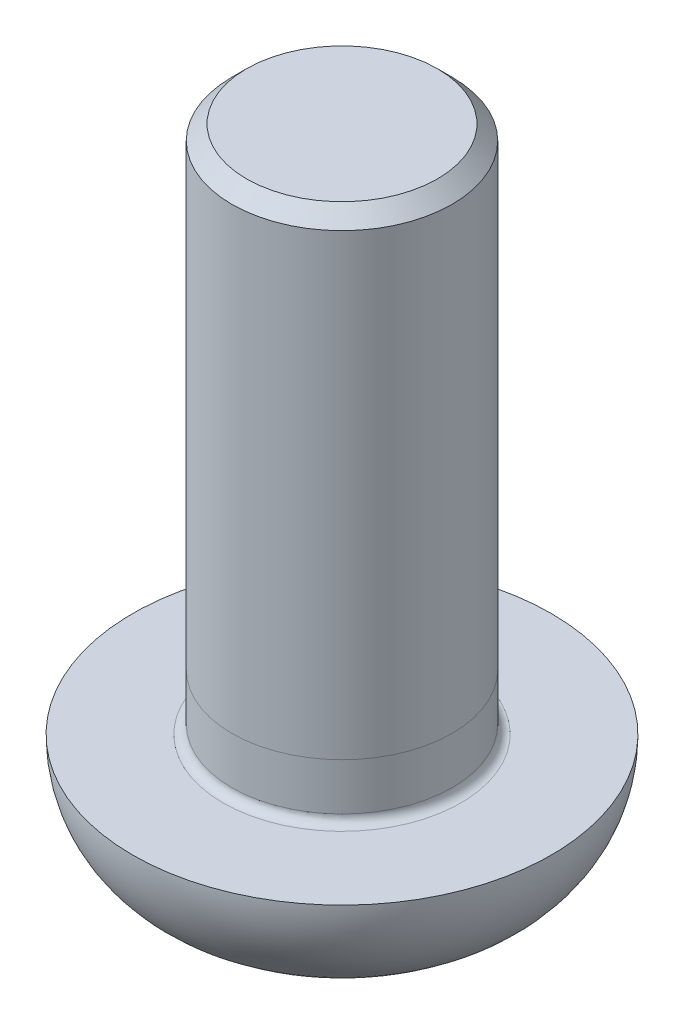
ISO-10303-21;
HEADER;
FILE_DESCRIPTION(('STEP AP214'),'2;1');
FILE_NAME('part.step','',(''),(''),'','','');
FILE_SCHEMA(('AUTOMOTIVE_DESIGN { 1 0 10303 214 1 1 1 1 }'));
ENDSEC;
DATA;
#1=APPLICATION_CONTEXT('core data for automotive mechanical design processes');
#2=APPLICATION_PROTOCOL_DEFINITION('international standard','automotive_design',2000,#1);
#3=PRODUCT_CONTEXT('',#1,'mechanical');
#4=PRODUCT('Part','Part','',(#3));
#5=PRODUCT_RELATED_PRODUCT_CATEGORY('part','',(#4));
#6=PRODUCT_DEFINITION_FORMATION('','',#4);
#7=PRODUCT_DEFINITION_CONTEXT('part definition',#1,'design');
#8=PRODUCT_DEFINITION('design','',#6,#7);
#9=PRODUCT_DEFINITION_SHAPE('','',#8);
#10=(LENGTH_UNIT() NAMED_UNIT(*) SI_UNIT(.MILLI.,.METRE.));
#11=(NAMED_UNIT(*) PLANE_ANGLE_UNIT() SI_UNIT($,.RADIAN.));
#12=(NAMED_UNIT(*) SI_UNIT($,.STERADIAN.) SOLID_ANGLE_UNIT());
#13=UNCERTAINTY_MEASURE_WITH_UNIT(LENGTH_MEASURE(1.E-05),#10,'distance_accuracy_value','');
#14=(GEOMETRIC_REPRESENTATION_CONTEXT(3) GLOBAL_UNCERTAINTY_ASSIGNED_CONTEXT((#13)) GLOBAL_UNIT_ASSIGNED_CONTEXT((#10,
#11,#12)) REPRESENTATION_CONTEXT('',''));
#15=CARTESIAN_POINT('',(0.,0.,0.));
#16=DIRECTION('',(0.,0.,1.));
#17=DIRECTION('',(1.,0.,0.));
#18=AXIS2_PLACEMENT_3D('',#15,#16,#17);
#19=CARTESIAN_POINT('',(0.,0.,0.));
#20=DIRECTION('',(0.,1.,0.));
#21=DIRECTION('',(0.,0.,1.));
#22=AXIS2_PLACEMENT_3D('',#19,#20,#21);
#23=CYLINDRICAL_SURFACE('',#22,2.5);
#24=CARTESIAN_POINT('',(0.,11.6666666666667,0.));
#25=DIRECTION('',(0.,1.,0.));
#26=DIRECTION('',(0.,0.,1.));
#27=AXIS2_PLACEMENT_3D('',#24,#25,#26);
#28=CIRCLE('',#27,2.5);
#29=CARTESIAN_POINT('',(0.,11.6666666666667,2.5));
#30=VERTEX_POINT('',#29);
#31=EDGE_CURVE('E28',#30,#30,#28,.F.);
#32=ORIENTED_EDGE('',*,*,#31,.T.);
#33=EDGE_LOOP('',(#32));
#34=FACE_BOUND('',#33,.T.);
#35=CARTESIAN_POINT('',(0.,1.26666666666666,0.));
#36=DIRECTION('',(0.,1.,0.));
#37=DIRECTION('',(0.,0.,1.));
#38=AXIS2_PLACEMENT_3D('',#35,#36,#37);
#39=CIRCLE('',#38,2.5);
#40=CARTESIAN_POINT('',(0.,1.26666666666666,2.5));
#41=VERTEX_POINT('',#40);
#42=EDGE_CURVE('E11',#41,#41,#39,.T.);
#43=ORIENTED_EDGE('',*,*,#42,.T.);
#44=EDGE_LOOP('',(#43));
#45=FACE_BOUND('',#44,.T.);
#46=ADVANCED_FACE('F18',(#34,#45),#23,.T.);
#47=ORIENTED_EDGE('',*,*,#42,.F.);
#48=EDGE_LOOP('',(#47));
#49=FACE_BOUND('',#48,.T.);
#50=CARTESIAN_POINT('',(0.,0.2,0.));
#51=DIRECTION('',(0.,1.,0.));
#52=DIRECTION('',(0.,0.,1.));
#53=AXIS2_PLACEMENT_3D('',#50,#51,#52);
#54=CIRCLE('',#53,2.5);
#55=CARTESIAN_POINT('',(0.,0.2,2.5));
#56=VERTEX_POINT('',#55);
#57=EDGE_CURVE('E280',#56,#56,#54,.T.);
#58=ORIENTED_EDGE('',*,*,#57,.T.);
#59=EDGE_LOOP('',(#58));
#60=FACE_BOUND('',#59,.T.);
#61=ADVANCED_FACE('F192',(#49,#60),#23,.T.);
#62=CARTESIAN_POINT('',(4.75,0.,0.));
#63=DIRECTION('',(0.,1.,0.));
#64=DIRECTION('',(0.,0.,1.));
#65=AXIS2_PLACEMENT_3D('',#62,#63,#64);
#66=PLANE('',#65);
#67=CARTESIAN_POINT('',(0.,0.,0.));
#68=DIRECTION('',(0.,1.,0.));
#69=DIRECTION('',(0.,0.,1.));
#70=AXIS2_PLACEMENT_3D('',#67,#68,#69);
#71=CIRCLE('',#70,2.7);
#72=CARTESIAN_POINT('',(0.,0.,2.7));
#73=VERTEX_POINT('',#72);
#74=EDGE_CURVE('E277',#73,#73,#71,.F.);
#75=ORIENTED_EDGE('',*,*,#74,.T.);
#76=EDGE_LOOP('',(#75));
#77=FACE_BOUND('',#76,.T.);
#78=CARTESIAN_POINT('',(0.,0.,0.));
#79=DIRECTION('',(0.,1.,0.));
#80=DIRECTION('',(0.,0.,1.));
#81=AXIS2_PLACEMENT_3D('',#78,#79,#80);
#82=CIRCLE('',#81,4.75);
#83=CARTESIAN_POINT('',(0.,0.,4.75));
#84=VERTEX_POINT('',#83);
#85=EDGE_CURVE('E108',#84,#84,#82,.T.);
#86=ORIENTED_EDGE('',*,*,#85,.T.);
#87=EDGE_LOOP('',(#86));
#88=FACE_BOUND('',#87,.T.);
#89=ADVANCED_FACE('F199',(#77,#88),#66,.T.);
#90=CARTESIAN_POINT('',(0.,12.,0.));
#91=DIRECTION('',(0.,1.,0.));
#92=DIRECTION('',(0.,0.,1.));
#93=AXIS2_PLACEMENT_3D('',#90,#91,#92);
#94=PLANE('',#93);
#95=CARTESIAN_POINT('',(0.,12.,0.));
#96=DIRECTION('',(0.,1.,0.));
#97=DIRECTION('',(0.,0.,1.));
#98=AXIS2_PLACEMENT_3D('',#95,#96,#97);
#99=CIRCLE('',#98,2.16666666666667);
#100=CARTESIAN_POINT('',(0.,12.,2.16666666666667));
#101=VERTEX_POINT('',#100);
#102=EDGE_CURVE('E282',#101,#101,#99,.T.);
#103=ORIENTED_EDGE('',*,*,#102,.T.);
#104=EDGE_LOOP('',(#103));
#105=FACE_BOUND('',#104,.T.);
#106=ADVANCED_FACE('F227',(#105),#94,.T.);
#107=CARTESIAN_POINT('',(0.,0.2,0.));
#108=DIRECTION('',(0.,1.,0.));
#109=DIRECTION('',(0.,0.,1.));
#110=AXIS2_PLACEMENT_3D('',#107,#108,#109);
#111=TOROIDAL_SURFACE('',#110,2.7,0.2);
#112=ORIENTED_EDGE('',*,*,#74,.F.);
#113=EDGE_LOOP('',(#112));
#114=FACE_BOUND('',#113,.T.);
#115=ORIENTED_EDGE('',*,*,#57,.F.);
#116=EDGE_LOOP('',(#115));
#117=FACE_BOUND('',#116,.T.);
#118=ADVANCED_FACE('F265',(#114,#117),#111,.F.);
#119=CARTESIAN_POINT('',(0.,12.,0.));
#120=DIRECTION('',(0.,-1.,0.));
#121=DIRECTION('',(0.,0.,-1.));
#122=AXIS2_PLACEMENT_3D('',#119,#120,#121);
#123=CONICAL_SURFACE('',#122,2.16666666666667,0.785398163397449);
#124=ORIENTED_EDGE('',*,*,#31,.F.);
#125=EDGE_LOOP('',(#124));
#126=FACE_BOUND('',#125,.T.);
#127=ORIENTED_EDGE('',*,*,#102,.F.);
#128=EDGE_LOOP('',(#127));
#129=FACE_BOUND('',#128,.T.);
#130=ADVANCED_FACE('F21',(#126,#129),#123,.T.);
#131=CARTESIAN_POINT('',(0.,0.,0.));
#132=DIRECTION('',(0.,-1.,0.));
#133=DIRECTION('',(0.,0.,-1.));
#134=AXIS2_PLACEMENT_3D('',#131,#132,#133);
#135=DEGENERATE_TOROIDAL_SURFACE('',#134,1.98223347818215,2.76776652181785,.T.);
#136=ORIENTED_EDGE('',*,*,#85,.F.);
#137=EDGE_LOOP('',(#136));
#138=FACE_BOUND('',#137,.T.);
#139=CARTESIAN_POINT('',(0.,-2.75,0.));
#140=DIRECTION('',(0.,-1.,0.));
#141=DIRECTION('',(0.,0.,-1.));
#142=AXIS2_PLACEMENT_3D('',#139,#140,#141);
#143=CIRCLE('',#142,2.29533333333334);
#144=CARTESIAN_POINT('',(0.,-2.75,-2.29533333333334));
#145=VERTEX_POINT('',#144);
#146=EDGE_CURVE('E119',#145,#145,#143,.T.);
#147=ORIENTED_EDGE('',*,*,#146,.F.);
#148=EDGE_LOOP('',(#147));
#149=FACE_BOUND('',#148,.T.);
#150=ADVANCED_FACE('F143',(#138,#149),#135,.T.);
#151=CARTESIAN_POINT('',(0.,0.0925836230047557,0.));
#152=DIRECTION('',(0.,-1.,0.));
#153=DIRECTION('',(0.,0.,-1.));
#154=AXIS2_PLACEMENT_3D('',#151,#152,#153);
#155=CONICAL_SURFACE('',#154,0.,1.0471975511966);
#156=CARTESIAN_POINT('',(0.,0.0925836230047561,0.));
#157=VERTEX_POINT('',#156);
#158=VERTEX_LOOP('',#157);
#159=FACE_BOUND('',#158,.T.);
#160=CARTESIAN_POINT('',(-0.865909933730604,-0.907483050328135,1.5002));
#161=CARTESIAN_POINT('',(-0.90396845419345,-0.885499233548862,1.43428070889745));
#162=CARTESIAN_POINT('',(-0.942355490953076,-0.865505266461506,1.36779241087776));
#163=CARTESIAN_POINT('',(-1.01979436916422,-0.83060447796419,1.23366433933493));
#164=CARTESIAN_POINT('',(-1.05884758728359,-0.81571000510285,1.16602218135311));
#165=CARTESIAN_POINT('',(-1.13646999803242,-0.792523058089927,1.03157622213015));
#166=CARTESIAN_POINT('',(-1.17502724286933,-0.784076288491498,0.96479311507275));
#167=CARTESIAN_POINT('',(-1.25232329150577,-0.773989954291537,0.830912431610116));
#168=CARTESIAN_POINT('',(-1.29106181408334,-0.772342040137575,0.763815342295616));
#169=CARTESIAN_POINT('',(-1.36345580713301,-0.775757999832789,0.6384252681708));
#170=CARTESIAN_POINT('',(-1.39712207785429,-0.779983136003665,0.580113576780177));
#171=CARTESIAN_POINT('',(-1.46423526865157,-0.793378152212355,0.463870120461215));
#172=CARTESIAN_POINT('',(-1.49768195634506,-0.802552614395533,0.405938758031212));
#173=CARTESIAN_POINT('',(-1.56493368410116,-0.825489560734679,0.289455348660846));
#174=CARTESIAN_POINT('',(-1.59873020609217,-0.83934933894113,0.230918055453307));
#175=CARTESIAN_POINT('',(-1.6658189879754,-0.87080616101634,0.11471687661364));
#176=CARTESIAN_POINT('',(-1.699112108342,-0.888395806669299,0.0570515005961895));
#177=CARTESIAN_POINT('',(-1.73216627762271,-0.907483050328134,-0.000200000000000156));
#178=B_SPLINE_CURVE_WITH_KNOTS('',3,(#160,#161,#162,#163,#164,#165,#166,#167,#168,#169,#170,
#171,#172,#173,#174,#175,#176,#177),.UNSPECIFIED.,.F.,.F.,(4,2,2,2,2,2,2,2,4),(0.,
0.237777822177385,0.476127422841921,0.708577067230594,0.940741159251585,1.14294352835891,
1.34533342091876,1.55221450553907,1.75868901573748),.UNSPECIFIED.);
#179=CARTESIAN_POINT('',(-0.866025403784442,-0.907416376995246,1.5));
#180=VERTEX_POINT('',#179);
#181=CARTESIAN_POINT('',(-1.73205080756887,-0.907416376995245,0.));
#182=VERTEX_POINT('',#181);
#183=EDGE_CURVE('E231',#180,#182,#178,.T.);
#184=ORIENTED_EDGE('',*,*,#183,.T.);
#185=CARTESIAN_POINT('',(-1.73216627762271,-0.907483050328134,0.000199999999999923));
#186=CARTESIAN_POINT('',(-1.69410775715987,-0.88549923354886,-0.0657192911025469));
#187=CARTESIAN_POINT('',(-1.65572072040024,-0.865505266461504,-0.132207589122234));
#188=CARTESIAN_POINT('',(-1.5782818421891,-0.830604477964188,-0.266335660665069));
#189=CARTESIAN_POINT('',(-1.53922862406973,-0.815710005102848,-0.333977818646885));
#190=CARTESIAN_POINT('',(-1.4616062133209,-0.792523058089924,-0.468423777869842));
#191=CARTESIAN_POINT('',(-1.42304896848399,-0.784076288491495,-0.535206884927247));
#192=CARTESIAN_POINT('',(-1.34575291984755,-0.773989954291535,-0.66908756838988));
#193=CARTESIAN_POINT('',(-1.30701439726998,-0.772342040137574,-0.736184657704378));
#194=CARTESIAN_POINT('',(-1.23462040422031,-0.775757999832787,-0.861574731829195));
#195=CARTESIAN_POINT('',(-1.20095413349903,-0.779983136003662,-0.919886423219819));
#196=CARTESIAN_POINT('',(-1.13384094270174,-0.793378152212352,-1.03612987953878));
#197=CARTESIAN_POINT('',(-1.10039425500826,-0.802552614395529,-1.09406124196879));
#198=CARTESIAN_POINT('',(-1.03314252725215,-0.825489560734676,-1.21054465133915));
#199=CARTESIAN_POINT('',(-0.999346005261149,-0.839349338941128,-1.26908194454669));
#200=CARTESIAN_POINT('',(-0.932257223377915,-0.870806161016338,-1.38528312338636));
#201=CARTESIAN_POINT('',(-0.898964103011318,-0.888395806669298,-1.44294849940381));
#202=CARTESIAN_POINT('',(-0.865909933730598,-0.907483050328134,-1.5002));
#203=B_SPLINE_CURVE_WITH_KNOTS('',3,(#185,#186,#187,#188,#189,#190,#191,#192,#193,#194,#195,
#196,#197,#198,#199,#200,#201,#202),.UNSPECIFIED.,.F.,.F.,(4,2,2,2,2,2,2,2,4),(0.,
0.237777822177384,0.476127422841919,0.70857706723059,0.940741159251581,1.14294352835891,
1.34533342091876,1.55221450553907,1.75868901573748),.UNSPECIFIED.);
#204=CARTESIAN_POINT('',(-0.866025403784436,-0.907416376995246,-1.5));
#205=VERTEX_POINT('',#204);
#206=EDGE_CURVE('E210',#182,#205,#203,.T.);
#207=ORIENTED_EDGE('',*,*,#206,.T.);
#208=CARTESIAN_POINT('',(-3.02145642388414,-1.85499597925637,-1.5));
#209=CARTESIAN_POINT('',(-2.95131363222548,-1.81872634413046,-1.5));
#210=CARTESIAN_POINT('',(-2.88107133565645,-1.78264804643317,-1.5));
#211=CARTESIAN_POINT('',(-2.74034345018755,-1.71096639873344,-1.5));
#212=CARTESIAN_POINT('',(-2.66985785718801,-1.67536305678391,-1.5));
#213=CARTESIAN_POINT('',(-2.45775199033708,-1.56929505571651,-1.5));
#214=CARTESIAN_POINT('',(-2.31570212462528,-1.49968664419272,-1.5));
#215=CARTESIAN_POINT('',(-2.0222700931377,-1.36025010782342,-1.5));
#216=CARTESIAN_POINT('',(-1.87079658899418,-1.29061113184475,-1.5));
#217=CARTESIAN_POINT('',(-1.64154653334164,-1.19092613711938,-1.5));
#218=CARTESIAN_POINT('',(-1.56480867695362,-1.15850064529067,-1.5));
#219=CARTESIAN_POINT('',(-1.41048071876465,-1.09575464897766,-1.5));
#220=CARTESIAN_POINT('',(-1.33289069925537,-1.06543394327289,-1.5));
#221=CARTESIAN_POINT('',(-1.16506923685472,-1.00326385892879,-1.5));
#222=CARTESIAN_POINT('',(-1.07467184506323,-0.971856304712149,-1.5));
#223=CARTESIAN_POINT('',(-0.892286344288553,-0.914121423485026,-1.5));
#224=CARTESIAN_POINT('',(-0.800299039468324,-0.887791605663107,-1.5));
#225=CARTESIAN_POINT('',(-0.616384962739645,-0.842503687233488,-1.5));
#226=CARTESIAN_POINT('',(-0.524492112475494,-0.823411627465088,-1.5));
#227=CARTESIAN_POINT('',(-0.339332787815074,-0.793844811415096,-1.5));
#228=CARTESIAN_POINT('',(-0.246067166383446,-0.783364916483212,-1.5));
#229=CARTESIAN_POINT('',(-0.0575309294622103,-0.772365176381842,-1.5));
#230=CARTESIAN_POINT('',(0.0377489009569059,-0.771995442319628,-1.5));
#231=CARTESIAN_POINT('',(0.227780550171567,-0.781659314746172,-1.5));
#232=CARTESIAN_POINT('',(0.322532205107233,-0.791695986775011,-1.5));
#233=CARTESIAN_POINT('',(0.512543387261529,-0.821037981256058,-1.5));
#234=CARTESIAN_POINT('',(0.60777273050509,-0.840531114897656,-1.5));
#235=CARTESIAN_POINT('',(0.796454627035134,-0.886704530221089,-1.5));
#236=CARTESIAN_POINT('',(0.889906503309468,-0.913387493957522,-1.5));
#237=CARTESIAN_POINT('',(1.07404515505715,-0.971638917632286,-1.5));
#238=CARTESIAN_POINT('',(1.16475145498871,-1.00314689099956,-1.5));
#239=CARTESIAN_POINT('',(1.34480972609266,-1.06984863548089,-1.49999999999999));
#240=CARTESIAN_POINT('',(1.43416131246012,-1.10504343218365,-1.49999999999999));
#241=CARTESIAN_POINT('',(1.61186009121394,-1.17813872958031,-1.5));
#242=CARTESIAN_POINT('',(1.70020602613332,-1.21604226107406,-1.49999999999999));
#243=CARTESIAN_POINT('',(1.87602988508462,-1.29381450595419,-1.49999999999999));
#244=CARTESIAN_POINT('',(1.96350775752119,-1.33368333532212,-1.49999999999999));
#245=CARTESIAN_POINT('',(2.1326218487944,-1.41248972462724,-1.49999999999999));
#246=CARTESIAN_POINT('',(2.21429755819774,-1.45134289392663,-1.49999999999999));
#247=CARTESIAN_POINT('',(2.37716279390999,-1.53006046378019,-1.49999999999999));
#248=CARTESIAN_POINT('',(2.4583523024031,-1.56992490111324,-1.49999999999999));
#249=CARTESIAN_POINT('',(2.62004632732072,-1.6503022330724,-1.49999999999999));
#250=CARTESIAN_POINT('',(2.70055225558183,-1.69081229420091,-1.49999999999999));
#251=CARTESIAN_POINT('',(2.86123337707426,-1.77246576421029,-1.49999999999999));
#252=CARTESIAN_POINT('',(2.94140859951954,-1.81360911555932,-1.49999999999999));
#253=CARTESIAN_POINT('',(3.02145642388415,-1.85499597925637,-1.5));
#254=B_SPLINE_CURVE_WITH_KNOTS('',3,(#208,#209,#210,#211,#212,#213,#214,#215,#216,#217,#218,
#219,#220,#221,#222,#223,#224,#225,#226,#227,#228,#229,#230,#231,#232,#233,#234,#235,#236,#237,
#238,#239,#240,#241,#242,#243,#244,#245,#246,#247,#248,#249,#250,#251,#252,#253),.UNSPECIFIED.,
.F.,.F.,(4,2,2,2,2,2,2,2,2,2,2,2,2,2,2,2,2,2,2,2,2,2,4),(0.,0.236895851279357,0.473795714055903,
0.948337668306544,1.44837680374914,1.69827558933975,1.94815045126331,2.23513816543362,
2.52198474176536,2.80322774532891,3.08430281656004,3.36954893314226,3.6548791019808,
3.94612368672111,4.23747706650592,4.52543887437366,4.81348100032893,5.10185062065299,
5.39023727945614,5.66156699087906,5.93290658449597,6.20327446222167,6.47361792142006),.UNSPECIFIED.);
#255=CARTESIAN_POINT('',(0.866025403784441,-0.907416376995245,-1.5));
#256=VERTEX_POINT('',#255);
#257=EDGE_CURVE('E106',#205,#256,#254,.T.);
#258=ORIENTED_EDGE('',*,*,#257,.T.);
#259=CARTESIAN_POINT('',(0.865909933730603,-0.907483050328134,-1.5002));
#260=CARTESIAN_POINT('',(0.903968454193449,-0.885499233548861,-1.43428070889745));
#261=CARTESIAN_POINT('',(0.942355490953075,-0.865505266461506,-1.36779241087777));
#262=CARTESIAN_POINT('',(1.01979436916422,-0.83060447796419,-1.23366433933493));
#263=CARTESIAN_POINT('',(1.05884758728358,-0.81571000510285,-1.16602218135311));
#264=CARTESIAN_POINT('',(1.13646999803242,-0.792523058089926,-1.03157622213016));
#265=CARTESIAN_POINT('',(1.17502724286933,-0.784076288491497,-0.964793115072752));
#266=CARTESIAN_POINT('',(1.25232329150577,-0.773989954291536,-0.830912431610118));
#267=CARTESIAN_POINT('',(1.29106181408333,-0.772342040137575,-0.763815342295619));
#268=CARTESIAN_POINT('',(1.363455807133,-0.775757999832788,-0.638425268170802));
#269=CARTESIAN_POINT('',(1.39712207785428,-0.779983136003664,-0.580113576780179));
#270=CARTESIAN_POINT('',(1.46423526865157,-0.793378152212355,-0.463870120461216));
#271=CARTESIAN_POINT('',(1.49768195634506,-0.802552614395532,-0.405938758031213));
#272=CARTESIAN_POINT('',(1.56493368410116,-0.825489560734678,-0.289455348660846));
#273=CARTESIAN_POINT('',(1.59873020609217,-0.83934933894113,-0.230918055453307));
#274=CARTESIAN_POINT('',(1.6658189879754,-0.87080616101634,-0.114716876613638));
#275=CARTESIAN_POINT('',(1.699112108342,-0.888395806669299,-0.0570515005961875));
#276=CARTESIAN_POINT('',(1.73216627762271,-0.907483050328134,0.000200000000002892));
#277=B_SPLINE_CURVE_WITH_KNOTS('',3,(#259,#260,#261,#262,#263,#264,#265,#266,#267,#268,#269,
#270,#271,#272,#273,#274,#275,#276),.UNSPECIFIED.,.F.,.F.,(4,2,2,2,2,2,2,2,4),(0.,
0.237777822177384,0.476127422841919,0.708577067230591,0.940741159251581,1.14294352835891,
1.34533342091876,1.55221450553907,1.75868901573748),.UNSPECIFIED.);
#278=CARTESIAN_POINT('',(1.73205080756887,-0.907416376995245,0.));
#279=VERTEX_POINT('',#278);
#280=EDGE_CURVE('E255',#256,#279,#277,.T.);
#281=ORIENTED_EDGE('',*,*,#280,.T.);
#282=CARTESIAN_POINT('',(1.73216627762271,-0.907483050328135,-0.000199999999997108));
#283=CARTESIAN_POINT('',(1.69410775715987,-0.885499233548861,0.0657192911025497));
#284=CARTESIAN_POINT('',(1.65572072040024,-0.865505266461505,0.132207589122237));
#285=CARTESIAN_POINT('',(1.5782818421891,-0.830604477964188,0.266335660665072));
#286=CARTESIAN_POINT('',(1.53922862406973,-0.815710005102849,0.333977818646888));
#287=CARTESIAN_POINT('',(1.4616062133209,-0.792523058089925,0.468423777869845));
#288=CARTESIAN_POINT('',(1.42304896848399,-0.784076288491496,0.53520688492725));
#289=CARTESIAN_POINT('',(1.34575291984754,-0.773989954291535,0.669087568389882));
#290=CARTESIAN_POINT('',(1.30701439726998,-0.772342040137574,0.73618465770438));
#291=CARTESIAN_POINT('',(1.23462040422031,-0.775757999832787,0.861574731829197));
#292=CARTESIAN_POINT('',(1.20095413349903,-0.779983136003662,0.919886423219821));
#293=CARTESIAN_POINT('',(1.13384094270174,-0.793378152212353,1.03612987953878));
#294=CARTESIAN_POINT('',(1.10039425500826,-0.802552614395531,1.09406124196879));
#295=CARTESIAN_POINT('',(1.03314252725215,-0.825489560734677,1.21054465133915));
#296=CARTESIAN_POINT('',(0.999346005261148,-0.839349338941129,1.26908194454669));
#297=CARTESIAN_POINT('',(0.932257223377913,-0.870806161016339,1.38528312338636));
#298=CARTESIAN_POINT('',(0.898964103011316,-0.888395806669299,1.44294849940381));
#299=CARTESIAN_POINT('',(0.865909933730595,-0.907483050328135,1.5002));
#300=B_SPLINE_CURVE_WITH_KNOTS('',3,(#282,#283,#284,#285,#286,#287,#288,#289,#290,#291,#292,
#293,#294,#295,#296,#297,#298,#299),.UNSPECIFIED.,.F.,.F.,(4,2,2,2,2,2,2,2,4),(0.,
0.237777822177384,0.47612742284192,0.708577067230591,0.940741159251581,1.14294352835891,
1.34533342091876,1.55221450553907,1.75868901573748),.UNSPECIFIED.);
#301=CARTESIAN_POINT('',(0.866025403784433,-0.907416376995246,1.5));
#302=VERTEX_POINT('',#301);
#303=EDGE_CURVE('E249',#279,#302,#300,.T.);
#304=ORIENTED_EDGE('',*,*,#303,.T.);
#305=CARTESIAN_POINT('',(3.02145642388414,-1.85499597925636,1.5));
#306=CARTESIAN_POINT('',(2.95131363222547,-1.81872634413045,1.5));
#307=CARTESIAN_POINT('',(2.88107133565644,-1.78264804643317,1.5));
#308=CARTESIAN_POINT('',(2.74034345018755,-1.71096639873344,1.50000000000001));
#309=CARTESIAN_POINT('',(2.66985785718801,-1.67536305678391,1.5));
#310=CARTESIAN_POINT('',(2.45775199033708,-1.56929505571651,1.5));
#311=CARTESIAN_POINT('',(2.31570212462528,-1.49968664419272,1.5));
#312=CARTESIAN_POINT('',(2.0222700931377,-1.36025010782342,1.5));
#313=CARTESIAN_POINT('',(1.87079658899418,-1.29061113184475,1.5));
#314=CARTESIAN_POINT('',(1.64154653334163,-1.19092613711938,1.5));
#315=CARTESIAN_POINT('',(1.56480867695361,-1.15850064529067,1.5));
#316=CARTESIAN_POINT('',(1.41048071876465,-1.09575464897766,1.5));
#317=CARTESIAN_POINT('',(1.33289069925537,-1.06543394327289,1.5));
#318=CARTESIAN_POINT('',(1.16506923685471,-1.00326385892879,1.5));
#319=CARTESIAN_POINT('',(1.07467184506323,-0.971856304712148,1.5));
#320=CARTESIAN_POINT('',(0.892286344288548,-0.914121423485025,1.5));
#321=CARTESIAN_POINT('',(0.800299039468318,-0.887791605663106,1.5));
#322=CARTESIAN_POINT('',(0.616384962739639,-0.842503687233487,1.5));
#323=CARTESIAN_POINT('',(0.524492112475487,-0.823411627465087,1.5));
#324=CARTESIAN_POINT('',(0.339332787815066,-0.793844811415096,1.5));
#325=CARTESIAN_POINT('',(0.246067166383438,-0.783364916483213,1.5));
#326=CARTESIAN_POINT('',(0.0575309294622016,-0.772365176381843,1.5));
#327=CARTESIAN_POINT('',(-0.0377489009569148,-0.771995442319629,1.5));
#328=CARTESIAN_POINT('',(-0.227780550171576,-0.781659314746173,1.5));
#329=CARTESIAN_POINT('',(-0.322532205107242,-0.791695986775013,1.5));
#330=CARTESIAN_POINT('',(-0.512543387261538,-0.82103798125606,1.5));
#331=CARTESIAN_POINT('',(-0.607772730505099,-0.840531114897658,1.5));
#332=CARTESIAN_POINT('',(-0.796454627035143,-0.886704530221092,1.5));
#333=CARTESIAN_POINT('',(-0.889906503309477,-0.913387493957526,1.5));
#334=CARTESIAN_POINT('',(-1.07404515505716,-0.97163891763229,1.5));
#335=CARTESIAN_POINT('',(-1.16475145498872,-1.00314689099957,1.5));
#336=CARTESIAN_POINT('',(-1.34480972609267,-1.0698486354809,1.49999999999999));
#337=CARTESIAN_POINT('',(-1.43416131246013,-1.10504343218365,1.49999999999999));
#338=CARTESIAN_POINT('',(-1.61186009121394,-1.17813872958031,1.49999999999999));
#339=CARTESIAN_POINT('',(-1.70020602613333,-1.21604226107406,1.49999999999999));
#340=CARTESIAN_POINT('',(-1.87602988508462,-1.29381450595419,1.49999999999999));
#341=CARTESIAN_POINT('',(-1.96350775752119,-1.33368333532212,1.49999999999999));
#342=CARTESIAN_POINT('',(-2.1326218487944,-1.41248972462725,1.49999999999999));
#343=CARTESIAN_POINT('',(-2.21429755819775,-1.45134289392663,1.49999999999999));
#344=CARTESIAN_POINT('',(-2.37716279390999,-1.53006046378019,1.49999999999999));
#345=CARTESIAN_POINT('',(-2.45835230240311,-1.56992490111324,1.49999999999999));
#346=CARTESIAN_POINT('',(-2.62004632732073,-1.6503022330724,1.49999999999999));
#347=CARTESIAN_POINT('',(-2.70055225558183,-1.69081229420091,1.49999999999999));
#348=CARTESIAN_POINT('',(-2.86123337707426,-1.77246576421029,1.49999999999999));
#349=CARTESIAN_POINT('',(-2.94140859951954,-1.81360911555932,1.49999999999999));
#350=CARTESIAN_POINT('',(-3.02145642388415,-1.85499597925637,1.5));
#351=B_SPLINE_CURVE_WITH_KNOTS('',3,(#305,#306,#307,#308,#309,#310,#311,#312,#313,#314,#315,
#316,#317,#318,#319,#320,#321,#322,#323,#324,#325,#326,#327,#328,#329,#330,#331,#332,#333,#334,
#335,#336,#337,#338,#339,#340,#341,#342,#343,#344,#345,#346,#347,#348,#349,#350),.UNSPECIFIED.,
.F.,.F.,(4,2,2,2,2,2,2,2,2,2,2,2,2,2,2,2,2,2,2,2,2,2,4),(0.,0.236895851279357,0.473795714055902,
0.948337668306543,1.44837680374914,1.69827558933975,1.9481504512633,2.23513816543362,
2.52198474176536,2.80322774532891,3.08430281656004,3.36954893314226,3.65487910198081,
3.94612368672112,4.23747706650592,4.52543887437366,4.81348100032894,5.10185062065299,
5.39023727945614,5.66156699087906,5.93290658449597,6.20327446222167,6.47361792142005),.UNSPECIFIED.);
#352=EDGE_CURVE('E241',#302,#180,#351,.T.);
#353=ORIENTED_EDGE('',*,*,#352,.T.);
#354=EDGE_LOOP('',(#184,#207,#258,#281,#304,#353));
#355=FACE_BOUND('',#354,.T.);
#356=ADVANCED_FACE('F176',(#159,#355),#155,.F.);
#357=CARTESIAN_POINT('',(-0.866025403784436,17.2015037027288,-1.5));
#358=DIRECTION('',(0.,0.,-1.));
#359=DIRECTION('',(-1.,0.,0.));
#360=AXIS2_PLACEMENT_3D('',#357,#358,#359);
#361=PLANE('',#360);
#362=CARTESIAN_POINT('',(2.65937634812055,-3.10401193097591,-1.5));
#363=CARTESIAN_POINT('',(2.53120070134799,-3.07413909502058,-1.5));
#364=CARTESIAN_POINT('',(2.40292071870203,-3.04468564852783,-1.49999999999999));
#365=CARTESIAN_POINT('',(2.14601955318443,-2.98719716387202,-1.49999999999999));
#366=CARTESIAN_POINT('',(2.01739831165161,-2.95916238877961,-1.49999999999999));
#367=CARTESIAN_POINT('',(1.75847591988681,-2.90483936544629,-1.49999999999999));
#368=CARTESIAN_POINT('',(1.62817060047403,-2.87857076333201,-1.49999999999999));
#369=CARTESIAN_POINT('',(1.36695300909498,-2.82911460443209,-1.5));
#370=CARTESIAN_POINT('',(1.23604067890611,-2.80592734980241,-1.5));
#371=CARTESIAN_POINT('',(0.977065471474464,-2.76477846002447,-1.5));
#372=CARTESIAN_POINT('',(0.849023202739873,-2.7466906865682,-1.5));
#373=CARTESIAN_POINT('',(0.592203499828399,-2.71690340601873,-1.5));
#374=CARTESIAN_POINT('',(0.463426316269502,-2.70520183895392,-1.5));
#375=CARTESIAN_POINT('',(0.20594347164001,-2.69020879672858,-1.5));
#376=CARTESIAN_POINT('',(0.077240188337309,-2.68687901840123,-1.5));
#377=CARTESIAN_POINT('',(-0.180089422710527,-2.6892375826211,-1.5));
#378=CARTESIAN_POINT('',(-0.308715744435466,-2.69492655670592,-1.5));
#379=CARTESIAN_POINT('',(-0.52986217584146,-2.71148432076775,-1.5));
#380=CARTESIAN_POINT('',(-0.622533465229346,-2.72048633332363,-1.5));
#381=CARTESIAN_POINT('',(-0.807485262938245,-2.74181141198927,-1.5));
#382=CARTESIAN_POINT('',(-0.899765780755238,-2.75413439692156,-1.5));
#383=CARTESIAN_POINT('',(-1.08424538413356,-2.78139706878037,-1.5));
#384=CARTESIAN_POINT('',(-1.17644317918339,-2.79634531829033,-1.5));
#385=CARTESIAN_POINT('',(-1.36050255987262,-2.82819152553301,-1.5));
#386=CARTESIAN_POINT('',(-1.45236412781592,-2.84508958440688,-1.5));
#387=CARTESIAN_POINT('',(-1.6377417836235,-2.88071781309414,-1.5));
#388=CARTESIAN_POINT('',(-1.73125183358107,-2.89947914270706,-1.5));
#389=CARTESIAN_POINT('',(-1.91803588743793,-2.93814151346181,-1.5));
#390=CARTESIAN_POINT('',(-2.01130988841312,-2.95804256865073,-1.5));
#391=CARTESIAN_POINT('',(-2.19713640726997,-2.99858811536818,-1.5));
#392=CARTESIAN_POINT('',(-2.28969000021665,-3.01922770319159,-1.5));
#393=CARTESIAN_POINT('',(-2.47464021817384,-3.06116924213638,-1.5));
#394=CARTESIAN_POINT('',(-2.5670368539972,-3.08247114550248,-1.5));
#395=CARTESIAN_POINT('',(-2.65937634812055,-3.1040119309759,-1.5));
#396=B_SPLINE_CURVE_WITH_KNOTS('',3,(#362,#363,#364,#365,#366,#367,#368,#369,#370,#371,#372,
#373,#374,#375,#376,#377,#378,#379,#380,#381,#382,#383,#384,#385,#386,#387,#388,#389,#390,#391,
#392,#393,#394,#395),.UNSPECIFIED.,.F.,.F.,(4,2,2,2,2,2,2,2,2,2,2,2,2,2,2,2,4),(0.,
0.3948412440674,0.789755439028269,1.18851185394861,1.58730734198952,1.97513907001565,
2.36284562274863,2.74877505980209,3.13473152273522,3.41398847940781,3.69323861057504,
3.97341705977716,4.25361004902523,4.53972148341107,4.82583644487873,5.1103147938328,
5.39477267824766),.UNSPECIFIED.);
#397=CARTESIAN_POINT('',(0.866025403784437,-2.75,-1.5));
#398=VERTEX_POINT('',#397);
#399=CARTESIAN_POINT('',(-0.866025403784437,-2.75,-1.5));
#400=VERTEX_POINT('',#399);
#401=EDGE_CURVE('E87',#398,#400,#396,.T.);
#402=ORIENTED_EDGE('',*,*,#401,.F.);
#403=DIRECTION('',(0.,-1.,0.));
#404=VECTOR('',#403,1.);
#405=CARTESIAN_POINT('',(0.866025403784441,17.2015037027288,-1.5));
#406=LINE('',#405,#404);
#407=EDGE_CURVE('E109',#256,#398,#406,.T.);
#408=ORIENTED_EDGE('',*,*,#407,.F.);
#409=ORIENTED_EDGE('',*,*,#257,.F.);
#410=DIRECTION('',(0.,-1.,0.));
#411=VECTOR('',#410,1.);
#412=CARTESIAN_POINT('',(-0.866025403784436,17.2015037027288,-1.5));
#413=LINE('',#412,#411);
#414=EDGE_CURVE('E99',#205,#400,#413,.T.);
#415=ORIENTED_EDGE('',*,*,#414,.T.);
#416=EDGE_LOOP('',(#402,#408,#409,#415));
#417=FACE_BOUND('',#416,.T.);
#418=ADVANCED_FACE('F104',(#417),#361,.F.);
#419=CARTESIAN_POINT('',(0.866025403784441,17.2015037027288,-1.5));
#420=DIRECTION('',(0.86602540378444,0.,-0.5));
#421=DIRECTION('',(-0.5,0.,-0.86602540378444));
#422=AXIS2_PLACEMENT_3D('',#419,#420,#421);
#423=PLANE('',#422);
#424=CARTESIAN_POINT('',(1.73216627762271,-2.75003094320149,0.000200000000002819));
#425=CARTESIAN_POINT('',(1.69619286442473,-2.7403863264284,-0.0621077793805764));
#426=CARTESIAN_POINT('',(1.66015421271208,-2.73163049597191,-0.124528555183176));
#427=CARTESIAN_POINT('',(1.58794959362277,-2.71624719001393,-0.249590623987013));
#428=CARTESIAN_POINT('',(1.55178358051624,-2.7096205796363,-0.31223199619472));
#429=CARTESIAN_POINT('',(1.47954358942114,-2.69888268944898,-0.437355331109757));
#430=CARTESIAN_POINT('',(1.44347010027403,-2.69475860000457,-0.499836447118838));
#431=CARTESIAN_POINT('',(1.37127710246616,-2.68922860518077,-0.624878387272778));
#432=CARTESIAN_POINT('',(1.33515760407141,-2.68782217350893,-0.687439193636389));
#433=CARTESIAN_POINT('',(1.26291860728191,-2.68782217350893,-0.81256080636361));
#434=CARTESIAN_POINT('',(1.22679910888716,-2.68922860518077,-0.87512161272722));
#435=CARTESIAN_POINT('',(1.15460611107929,-2.69475860000457,-1.00016355288116));
#436=CARTESIAN_POINT('',(1.11853262193218,-2.69888268944898,-1.06264466889024));
#437=CARTESIAN_POINT('',(1.04629263083708,-2.7096205796363,-1.18776800380528));
#438=CARTESIAN_POINT('',(1.01012661773055,-2.71624719001393,-1.25040937601299));
#439=CARTESIAN_POINT('',(0.937921998641244,-2.73163049597191,-1.37547144481682));
#440=CARTESIAN_POINT('',(0.901883346928588,-2.7403863264284,-1.43789222061942));
#441=CARTESIAN_POINT('',(0.865909933730603,-2.75003094320149,-1.5002));
#442=B_SPLINE_CURVE_WITH_KNOTS('',3,(#424,#425,#426,#427,#428,#429,#430,#431,#432,#433,#434,
#435,#436,#437,#438,#439,#440,#441),.UNSPECIFIED.,.F.,.F.,(4,2,2,2,2,2,2,2,4),(0.,
0.217782584290281,0.435653544301783,0.652399669875338,0.869103816917188,1.08580796395904,
1.30255408953259,1.52042504954409,1.73820763383438),.UNSPECIFIED.);
#443=CARTESIAN_POINT('',(1.73205080756888,-2.75,0.));
#444=VERTEX_POINT('',#443);
#445=EDGE_CURVE('E94',#444,#398,#442,.T.);
#446=ORIENTED_EDGE('',*,*,#445,.F.);
#447=DIRECTION('',(0.,-1.,0.));
#448=VECTOR('',#447,1.);
#449=CARTESIAN_POINT('',(1.73205080756887,17.2015037027288,0.));
#450=LINE('',#449,#448);
#451=EDGE_CURVE('E313',#279,#444,#450,.T.);
#452=ORIENTED_EDGE('',*,*,#451,.F.);
#453=ORIENTED_EDGE('',*,*,#280,.F.);
#454=ORIENTED_EDGE('',*,*,#407,.T.);
#455=EDGE_LOOP('',(#446,#452,#453,#454));
#456=FACE_BOUND('',#455,.T.);
#457=ADVANCED_FACE('F175',(#456),#423,.F.);
#458=CARTESIAN_POINT('',(1.73205080756887,17.2015037027288,0.));
#459=DIRECTION('',(0.866025403784437,0.,0.5));
#460=DIRECTION('',(0.5,0.,-0.866025403784437));
#461=AXIS2_PLACEMENT_3D('',#458,#459,#460);
#462=PLANE('',#461);
#463=CARTESIAN_POINT('',(0.865909933730595,-2.75003094320149,1.5002));
#464=CARTESIAN_POINT('',(0.901883346928581,-2.7403863264284,1.43789222061942));
#465=CARTESIAN_POINT('',(0.937921998641238,-2.73163049597191,1.37547144481682));
#466=CARTESIAN_POINT('',(1.01012661773055,-2.71624719001393,1.25040937601299));
#467=CARTESIAN_POINT('',(1.04629263083707,-2.7096205796363,1.18776800380528));
#468=CARTESIAN_POINT('',(1.11853262193217,-2.69888268944898,1.06264466889024));
#469=CARTESIAN_POINT('',(1.15460611107928,-2.69475860000457,1.00016355288116));
#470=CARTESIAN_POINT('',(1.22679910888715,-2.68922860518077,0.875121612727223));
#471=CARTESIAN_POINT('',(1.2629186072819,-2.68782217350893,0.812560806363612));
#472=CARTESIAN_POINT('',(1.33515760407141,-2.68782217350893,0.687439193636391));
#473=CARTESIAN_POINT('',(1.37127710246616,-2.68922860518077,0.624878387272781));
#474=CARTESIAN_POINT('',(1.44347010027403,-2.69475860000457,0.499836447118841));
#475=CARTESIAN_POINT('',(1.47954358942114,-2.69888268944898,0.43735533110976));
#476=CARTESIAN_POINT('',(1.55178358051624,-2.7096205796363,0.312231996194723));
#477=CARTESIAN_POINT('',(1.58794959362277,-2.71624719001393,0.249590623987016));
#478=CARTESIAN_POINT('',(1.66015421271207,-2.73163049597191,0.12452855518318));
#479=CARTESIAN_POINT('',(1.69619286442473,-2.7403863264284,0.0621077793805805));
#480=CARTESIAN_POINT('',(1.73216627762271,-2.75003094320149,-0.000199999999997276));
#481=B_SPLINE_CURVE_WITH_KNOTS('',3,(#463,#464,#465,#466,#467,#468,#469,#470,#471,#472,#473,
#474,#475,#476,#477,#478,#479,#480),.UNSPECIFIED.,.F.,.F.,(4,2,2,2,2,2,2,2,4),(0.,
0.217782584290281,0.435653544301783,0.652399669875338,0.869103816917188,1.08580796395904,
1.30255408953259,1.52042504954409,1.73820763383438),.UNSPECIFIED.);
#482=CARTESIAN_POINT('',(0.86602540378444,-2.75,1.5));
#483=VERTEX_POINT('',#482);
#484=EDGE_CURVE('E128',#483,#444,#481,.T.);
#485=ORIENTED_EDGE('',*,*,#484,.F.);
#486=DIRECTION('',(0.,-1.,0.));
#487=VECTOR('',#486,1.);
#488=CARTESIAN_POINT('',(0.866025403784433,17.2015037027288,1.5));
#489=LINE('',#488,#487);
#490=EDGE_CURVE('E310',#302,#483,#489,.T.);
#491=ORIENTED_EDGE('',*,*,#490,.F.);
#492=ORIENTED_EDGE('',*,*,#303,.F.);
#493=ORIENTED_EDGE('',*,*,#451,.T.);
#494=EDGE_LOOP('',(#485,#491,#492,#493));
#495=FACE_BOUND('',#494,.T.);
#496=ADVANCED_FACE('F179',(#495),#462,.F.);
#497=CARTESIAN_POINT('',(0.866025403784433,17.2015037027288,1.5));
#498=DIRECTION('',(0.,0.,1.));
#499=DIRECTION('',(1.,0.,0.));
#500=AXIS2_PLACEMENT_3D('',#497,#498,#499);
#501=PLANE('',#500);
#502=CARTESIAN_POINT('',(-2.65937634812055,-3.1040119309759,1.5));
#503=CARTESIAN_POINT('',(-2.53120070134798,-3.07413909502057,1.49999999999999));
#504=CARTESIAN_POINT('',(-2.40292071870203,-3.04468564852782,1.49999999999999));
#505=CARTESIAN_POINT('',(-2.14601955318442,-2.98719716387201,1.49999999999999));
#506=CARTESIAN_POINT('',(-2.01739831165161,-2.95916238877961,1.49999999999999));
#507=CARTESIAN_POINT('',(-1.7584759198868,-2.90483936544628,1.49999999999999));
#508=CARTESIAN_POINT('',(-1.62817060047403,-2.878570763332,1.49999999999999));
#509=CARTESIAN_POINT('',(-1.36695300909498,-2.82911460443208,1.49999999999999));
#510=CARTESIAN_POINT('',(-1.23604067890611,-2.80592734980241,1.49999999999999));
#511=CARTESIAN_POINT('',(-0.977065471474459,-2.76477846002446,1.5));
#512=CARTESIAN_POINT('',(-0.849023202739868,-2.7466906865682,1.5));
#513=CARTESIAN_POINT('',(-0.592203499828394,-2.71690340601873,1.5));
#514=CARTESIAN_POINT('',(-0.463426316269497,-2.70520183895391,1.5));
#515=CARTESIAN_POINT('',(-0.205943471640005,-2.69020879672858,1.5));
#516=CARTESIAN_POINT('',(-0.0772401883373048,-2.68687901840123,1.5));
#517=CARTESIAN_POINT('',(0.180089422710531,-2.6892375826211,1.5));
#518=CARTESIAN_POINT('',(0.30871574443547,-2.69492655670592,1.5));
#519=CARTESIAN_POINT('',(0.529862175841464,-2.71148432076775,1.5));
#520=CARTESIAN_POINT('',(0.622533465229349,-2.72048633332363,1.5));
#521=CARTESIAN_POINT('',(0.807485262938248,-2.74181141198927,1.5));
#522=CARTESIAN_POINT('',(0.89976578075524,-2.75413439692157,1.5));
#523=CARTESIAN_POINT('',(1.08424538413357,-2.78139706878038,1.5));
#524=CARTESIAN_POINT('',(1.17644317918339,-2.79634531829033,1.5));
#525=CARTESIAN_POINT('',(1.36050255987262,-2.82819152553301,1.5));
#526=CARTESIAN_POINT('',(1.45236412781592,-2.84508958440688,1.5));
#527=CARTESIAN_POINT('',(1.6377417836235,-2.88071781309414,1.5));
#528=CARTESIAN_POINT('',(1.73125183358107,-2.89947914270707,1.5));
#529=CARTESIAN_POINT('',(1.91803588743793,-2.93814151346181,1.5));
#530=CARTESIAN_POINT('',(2.01130988841312,-2.95804256865074,1.5));
#531=CARTESIAN_POINT('',(2.19713640726996,-2.99858811536819,1.5));
#532=CARTESIAN_POINT('',(2.28969000021665,-3.0192277031916,1.5));
#533=CARTESIAN_POINT('',(2.47464021817384,-3.06116924213639,1.5));
#534=CARTESIAN_POINT('',(2.56703685399719,-3.08247114550249,1.5));
#535=CARTESIAN_POINT('',(2.65937634812054,-3.10401193097591,1.5));
#536=B_SPLINE_CURVE_WITH_KNOTS('',3,(#502,#503,#504,#505,#506,#507,#508,#509,#510,#511,#512,
#513,#514,#515,#516,#517,#518,#519,#520,#521,#522,#523,#524,#525,#526,#527,#528,#529,#530,#531,
#532,#533,#534,#535),.UNSPECIFIED.,.F.,.F.,(4,2,2,2,2,2,2,2,2,2,2,2,2,2,2,2,4),(0.,
0.3948412440674,0.789755439028269,1.18851185394861,1.58730734198952,1.97513907001565,
2.36284562274862,2.74877505980209,3.13473152273522,3.41398847940781,3.69323861057504,
3.97341705977716,4.25361004902523,4.53972148341106,4.82583644487873,5.11031479383279,
5.39477267824765),.UNSPECIFIED.);
#537=CARTESIAN_POINT('',(-0.866025403784442,-2.75,1.5));
#538=VERTEX_POINT('',#537);
#539=EDGE_CURVE('E81',#538,#483,#536,.T.);
#540=ORIENTED_EDGE('',*,*,#539,.F.);
#541=DIRECTION('',(0.,-1.,0.));
#542=VECTOR('',#541,1.);
#543=CARTESIAN_POINT('',(-0.866025403784442,17.2015037027288,1.5));
#544=LINE('',#543,#542);
#545=EDGE_CURVE('E42',#180,#538,#544,.T.);
#546=ORIENTED_EDGE('',*,*,#545,.F.);
#547=ORIENTED_EDGE('',*,*,#352,.F.);
#548=ORIENTED_EDGE('',*,*,#490,.T.);
#549=EDGE_LOOP('',(#540,#546,#547,#548));
#550=FACE_BOUND('',#549,.T.);
#551=ADVANCED_FACE('F135',(#550),#501,.F.);
#552=CARTESIAN_POINT('',(-0.866025403784442,17.2015037027288,1.5));
#553=DIRECTION('',(-0.86602540378444,0.,0.5));
#554=DIRECTION('',(0.5,0.,0.86602540378444));
#555=AXIS2_PLACEMENT_3D('',#552,#553,#554);
#556=PLANE('',#555);
#557=CARTESIAN_POINT('',(-1.73216627762271,-2.75003094320148,-0.000200000000000038));
#558=CARTESIAN_POINT('',(-1.69619286442473,-2.74038632642839,0.0621077793805788));
#559=CARTESIAN_POINT('',(-1.66015421271208,-2.73163049597191,0.124528555183179));
#560=CARTESIAN_POINT('',(-1.58794959362277,-2.71624719001392,0.249590623987015));
#561=CARTESIAN_POINT('',(-1.55178358051624,-2.7096205796363,0.312231996194722));
#562=CARTESIAN_POINT('',(-1.47954358942114,-2.69888268944898,0.437355331109759));
#563=CARTESIAN_POINT('',(-1.44347010027403,-2.69475860000457,0.49983644711884));
#564=CARTESIAN_POINT('',(-1.37127710246616,-2.68922860518076,0.62487838727278));
#565=CARTESIAN_POINT('',(-1.33515760407141,-2.68782217350893,0.68743919363639));
#566=CARTESIAN_POINT('',(-1.26291860728191,-2.68782217350893,0.812560806363611));
#567=CARTESIAN_POINT('',(-1.22679910888716,-2.68922860518076,0.875121612727221));
#568=CARTESIAN_POINT('',(-1.15460611107929,-2.69475860000457,1.00016355288116));
#569=CARTESIAN_POINT('',(-1.11853262193218,-2.69888268944898,1.06264466889024));
#570=CARTESIAN_POINT('',(-1.04629263083708,-2.7096205796363,1.18776800380528));
#571=CARTESIAN_POINT('',(-1.01012661773055,-2.71624719001393,1.25040937601299));
#572=CARTESIAN_POINT('',(-0.937921998641245,-2.73163049597191,1.37547144481682));
#573=CARTESIAN_POINT('',(-0.901883346928589,-2.74038632642839,1.43789222061942));
#574=CARTESIAN_POINT('',(-0.865909933730604,-2.75003094320148,1.5002));
#575=B_SPLINE_CURVE_WITH_KNOTS('',3,(#557,#558,#559,#560,#561,#562,#563,#564,#565,#566,#567,
#568,#569,#570,#571,#572,#573,#574),.UNSPECIFIED.,.F.,.F.,(4,2,2,2,2,2,2,2,4),(0.,
0.217782584290281,0.435653544301782,0.652399669875337,0.869103816917186,1.08580796395904,
1.30255408953259,1.52042504954409,1.73820763383437),.UNSPECIFIED.);
#576=CARTESIAN_POINT('',(-1.73205080756887,-2.75,0.));
#577=VERTEX_POINT('',#576);
#578=EDGE_CURVE('E149',#577,#538,#575,.T.);
#579=ORIENTED_EDGE('',*,*,#578,.F.);
#580=DIRECTION('',(0.,-1.,0.));
#581=VECTOR('',#580,1.);
#582=CARTESIAN_POINT('',(-1.73205080756887,17.2015037027288,0.));
#583=LINE('',#582,#581);
#584=EDGE_CURVE('E102',#182,#577,#583,.T.);
#585=ORIENTED_EDGE('',*,*,#584,.F.);
#586=ORIENTED_EDGE('',*,*,#183,.F.);
#587=ORIENTED_EDGE('',*,*,#545,.T.);
#588=EDGE_LOOP('',(#579,#585,#586,#587));
#589=FACE_BOUND('',#588,.T.);
#590=ADVANCED_FACE('F188',(#589),#556,.F.);
#591=CARTESIAN_POINT('',(-1.73205080756887,17.2015037027288,0.));
#592=DIRECTION('',(-0.866025403784439,0.,-0.5));
#593=DIRECTION('',(-0.5,0.,0.866025403784439));
#594=AXIS2_PLACEMENT_3D('',#591,#592,#593);
#595=PLANE('',#594);
#596=CARTESIAN_POINT('',(-0.865909933730598,-2.75003094320148,-1.5002));
#597=CARTESIAN_POINT('',(-0.901883346928583,-2.74038632642839,-1.43789222061942));
#598=CARTESIAN_POINT('',(-0.937921998641239,-2.73163049597191,-1.37547144481682));
#599=CARTESIAN_POINT('',(-1.01012661773055,-2.71624719001392,-1.25040937601299));
#600=CARTESIAN_POINT('',(-1.04629263083707,-2.7096205796363,-1.18776800380528));
#601=CARTESIAN_POINT('',(-1.11853262193217,-2.69888268944898,-1.06264466889024));
#602=CARTESIAN_POINT('',(-1.15460611107928,-2.69475860000457,-1.00016355288116));
#603=CARTESIAN_POINT('',(-1.22679910888715,-2.68922860518076,-0.875121612727221));
#604=CARTESIAN_POINT('',(-1.26291860728191,-2.68782217350893,-0.81256080636361));
#605=CARTESIAN_POINT('',(-1.33515760407141,-2.68782217350893,-0.687439193636389));
#606=CARTESIAN_POINT('',(-1.37127710246616,-2.68922860518076,-0.624878387272779));
#607=CARTESIAN_POINT('',(-1.44347010027403,-2.69475860000457,-0.499836447118839));
#608=CARTESIAN_POINT('',(-1.47954358942114,-2.69888268944898,-0.437355331109757));
#609=CARTESIAN_POINT('',(-1.55178358051624,-2.7096205796363,-0.312231996194721));
#610=CARTESIAN_POINT('',(-1.58794959362277,-2.71624719001392,-0.249590623987013));
#611=CARTESIAN_POINT('',(-1.66015421271207,-2.7316304959719,-0.124528555183177));
#612=CARTESIAN_POINT('',(-1.69619286442473,-2.74038632642839,-0.0621077793805778));
#613=CARTESIAN_POINT('',(-1.73216627762271,-2.75003094320148,0.000199999999999837));
#614=B_SPLINE_CURVE_WITH_KNOTS('',3,(#596,#597,#598,#599,#600,#601,#602,#603,#604,#605,#606,
#607,#608,#609,#610,#611,#612,#613),.UNSPECIFIED.,.F.,.F.,(4,2,2,2,2,2,2,2,4),(0.,
0.217782584290281,0.435653544301782,0.652399669875338,0.869103816917188,1.08580796395904,
1.30255408953259,1.52042504954409,1.73820763383438),.UNSPECIFIED.);
#615=EDGE_CURVE('E34',#400,#577,#614,.T.);
#616=ORIENTED_EDGE('',*,*,#615,.F.);
#617=ORIENTED_EDGE('',*,*,#414,.F.);
#618=ORIENTED_EDGE('',*,*,#206,.F.);
#619=ORIENTED_EDGE('',*,*,#584,.T.);
#620=EDGE_LOOP('',(#616,#617,#618,#619));
#621=FACE_BOUND('',#620,.T.);
#622=ADVANCED_FACE('F98',(#621),#595,.F.);
#623=CARTESIAN_POINT('',(0.,-2.28589838486225,0.));
#624=DIRECTION('',(0.,-1.,0.));
#625=DIRECTION('',(1.,0.,0.));
#626=AXIS2_PLACEMENT_3D('',#623,#624,#625);
#627=CONICAL_SURFACE('',#626,0.,1.30899693899575);
#628=ORIENTED_EDGE('',*,*,#401,.T.);
#629=CARTESIAN_POINT('',(0.,-2.75,0.));
#630=DIRECTION('',(0.,-1.,0.));
#631=DIRECTION('',(1.,0.,0.));
#632=AXIS2_PLACEMENT_3D('',#629,#630,#631);
#633=CIRCLE('',#632,1.73205080756888);
#634=EDGE_CURVE('E82',#400,#398,#633,.T.);
#635=ORIENTED_EDGE('',*,*,#634,.T.);
#636=EDGE_LOOP('',(#628,#635));
#637=FACE_BOUND('',#636,.T.);
#638=ADVANCED_FACE('F88',(#637),#627,.F.);
#639=ORIENTED_EDGE('',*,*,#445,.T.);
#640=EDGE_CURVE('E115',#398,#444,#633,.T.);
#641=ORIENTED_EDGE('',*,*,#640,.T.);
#642=EDGE_LOOP('',(#639,#641));
#643=FACE_BOUND('',#642,.T.);
#644=ADVANCED_FACE('F324',(#643),#627,.F.);
#645=ORIENTED_EDGE('',*,*,#484,.T.);
#646=EDGE_CURVE('E116',#444,#483,#633,.T.);
#647=ORIENTED_EDGE('',*,*,#646,.T.);
#648=EDGE_LOOP('',(#645,#647));
#649=FACE_BOUND('',#648,.T.);
#650=ADVANCED_FACE('F326',(#649),#627,.F.);
#651=ORIENTED_EDGE('',*,*,#539,.T.);
#652=EDGE_CURVE('E294',#483,#538,#633,.T.);
#653=ORIENTED_EDGE('',*,*,#652,.T.);
#654=EDGE_LOOP('',(#651,#653));
#655=FACE_BOUND('',#654,.T.);
#656=ADVANCED_FACE('F295',(#655),#627,.F.);
#657=ORIENTED_EDGE('',*,*,#578,.T.);
#658=EDGE_CURVE('E84',#538,#577,#633,.T.);
#659=ORIENTED_EDGE('',*,*,#658,.T.);
#660=EDGE_LOOP('',(#657,#659));
#661=FACE_BOUND('',#660,.T.);
#662=ADVANCED_FACE('F142',(#661),#627,.F.);
#663=ORIENTED_EDGE('',*,*,#615,.T.);
#664=EDGE_CURVE('E75',#577,#400,#633,.T.);
#665=ORIENTED_EDGE('',*,*,#664,.T.);
#666=EDGE_LOOP('',(#663,#665));
#667=FACE_BOUND('',#666,.T.);
#668=ADVANCED_FACE('F77',(#667),#627,.F.);
#669=CARTESIAN_POINT('',(0.,-2.75,0.));
#670=DIRECTION('',(0.,-1.,0.));
#671=DIRECTION('',(0.,0.,-1.));
#672=AXIS2_PLACEMENT_3D('',#669,#670,#671);
#673=PLANE('',#672);
#674=ORIENTED_EDGE('',*,*,#664,.F.);
#675=ORIENTED_EDGE('',*,*,#658,.F.);
#676=ORIENTED_EDGE('',*,*,#652,.F.);
#677=ORIENTED_EDGE('',*,*,#646,.F.);
#678=ORIENTED_EDGE('',*,*,#640,.F.);
#679=ORIENTED_EDGE('',*,*,#634,.F.);
#680=EDGE_LOOP('',(#674,#675,#676,#677,#678,#679));
#681=FACE_BOUND('',#680,.T.);
#682=ORIENTED_EDGE('',*,*,#146,.T.);
#683=EDGE_LOOP('',(#682));
#684=FACE_BOUND('',#683,.T.);
#685=ADVANCED_FACE('F112',(#681,#684),#673,.T.);
#686=CLOSED_SHELL('',(#46,#61,#89,#106,#118,#130,#150,#356,#418,#457,#496,#551,#590,#622,#638,
#644,#650,#656,#662,#668,#685));
#687=MANIFOLD_SOLID_BREP('B1',#686);
#688=ADVANCED_BREP_SHAPE_REPRESENTATION('',(#18,#687),#14);
#689=SHAPE_DEFINITION_REPRESENTATION(#9,#688);
ENDSEC;
END-ISO-10303-21;
